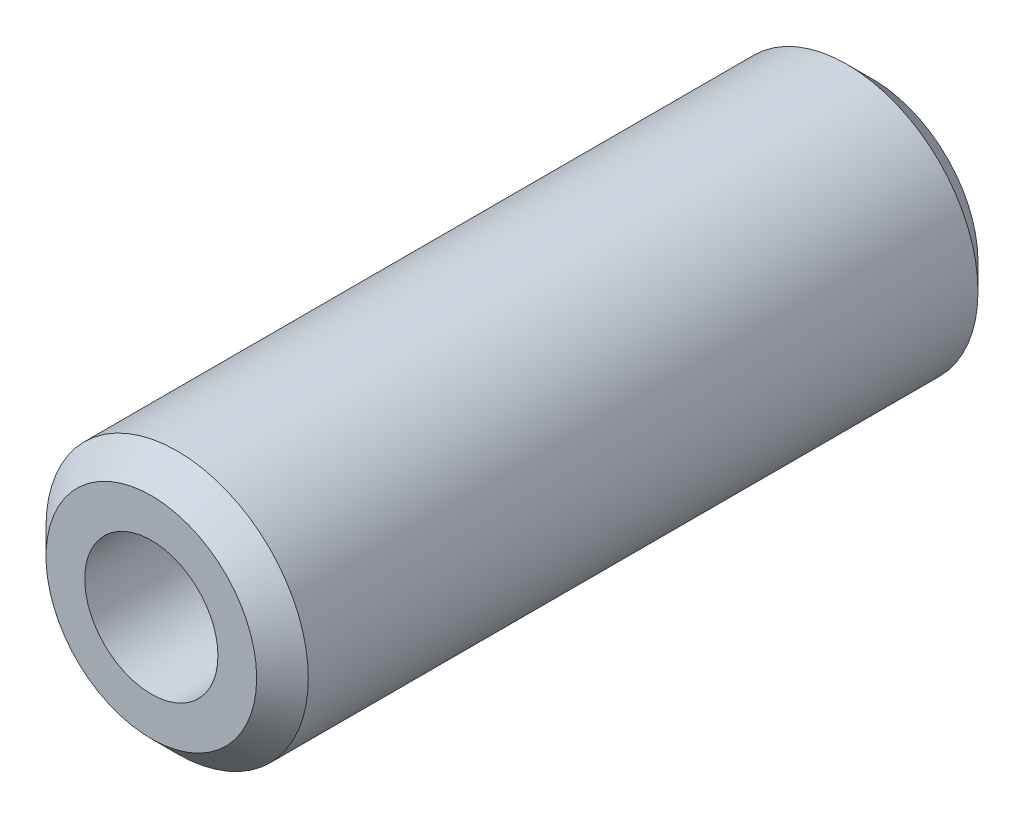
ISO-10303-21;
HEADER;
FILE_DESCRIPTION(('STEP AP214'),'2;1');
FILE_NAME('part.step','',(''),(''),'','','');
FILE_SCHEMA(('AUTOMOTIVE_DESIGN { 1 0 10303 214 1 1 1 1 }'));
ENDSEC;
DATA;
#1=APPLICATION_CONTEXT('core data for automotive mechanical design processes');
#2=APPLICATION_PROTOCOL_DEFINITION('international standard','automotive_design',2000,#1);
#3=PRODUCT_CONTEXT('',#1,'mechanical');
#4=PRODUCT('Part','Part','',(#3));
#5=PRODUCT_RELATED_PRODUCT_CATEGORY('part','',(#4));
#6=PRODUCT_DEFINITION_FORMATION('','',#4);
#7=PRODUCT_DEFINITION_CONTEXT('part definition',#1,'design');
#8=PRODUCT_DEFINITION('design','',#6,#7);
#9=PRODUCT_DEFINITION_SHAPE('','',#8);
#10=(LENGTH_UNIT() NAMED_UNIT(*) SI_UNIT(.MILLI.,.METRE.));
#11=(NAMED_UNIT(*) PLANE_ANGLE_UNIT() SI_UNIT($,.RADIAN.));
#12=(NAMED_UNIT(*) SI_UNIT($,.STERADIAN.) SOLID_ANGLE_UNIT());
#13=UNCERTAINTY_MEASURE_WITH_UNIT(LENGTH_MEASURE(1.E-05),#10,'distance_accuracy_value','');
#14=(GEOMETRIC_REPRESENTATION_CONTEXT(3) GLOBAL_UNCERTAINTY_ASSIGNED_CONTEXT((#13)) GLOBAL_UNIT_ASSIGNED_CONTEXT((#10,
#11,#12)) REPRESENTATION_CONTEXT('',''));
#15=CARTESIAN_POINT('',(0.,0.,0.));
#16=DIRECTION('',(0.,0.,1.));
#17=DIRECTION('',(1.,0.,0.));
#18=AXIS2_PLACEMENT_3D('',#15,#16,#17);
#19=CARTESIAN_POINT('',(0.,0.,34.925));
#20=DIRECTION('',(0.,0.,-1.));
#21=DIRECTION('',(-1.,0.,0.));
#22=AXIS2_PLACEMENT_3D('',#19,#20,#21);
#23=CYLINDRICAL_SURFACE('',#22,12.7);
#24=CARTESIAN_POINT('',(0.,0.,-32.425));
#25=DIRECTION('',(0.,0.,1.));
#26=DIRECTION('',(1.,0.,0.));
#27=AXIS2_PLACEMENT_3D('',#24,#25,#26);
#28=CIRCLE('',#27,12.7);
#29=CARTESIAN_POINT('',(12.7,0.,-32.425));
#30=VERTEX_POINT('',#29);
#31=EDGE_CURVE('E45',#30,#30,#28,.T.);
#32=ORIENTED_EDGE('',*,*,#31,.T.);
#33=EDGE_LOOP('',(#32));
#34=FACE_BOUND('',#33,.T.);
#35=CARTESIAN_POINT('',(0.,0.,32.425));
#36=DIRECTION('',(0.,0.,1.));
#37=DIRECTION('',(1.,0.,0.));
#38=AXIS2_PLACEMENT_3D('',#35,#36,#37);
#39=CIRCLE('',#38,12.7);
#40=CARTESIAN_POINT('',(12.7,0.,32.425));
#41=VERTEX_POINT('',#40);
#42=EDGE_CURVE('E49',#41,#41,#39,.F.);
#43=ORIENTED_EDGE('',*,*,#42,.T.);
#44=EDGE_LOOP('',(#43));
#45=FACE_BOUND('',#44,.T.);
#46=ADVANCED_FACE('F33',(#34,#45),#23,.T.);
#47=CARTESIAN_POINT('',(0.,0.,34.925));
#48=DIRECTION('',(0.,0.,1.));
#49=DIRECTION('',(1.,0.,0.));
#50=AXIS2_PLACEMENT_3D('',#47,#48,#49);
#51=PLANE('',#50);
#52=CARTESIAN_POINT('',(0.,0.,34.925));
#53=DIRECTION('',(0.,0.,1.));
#54=DIRECTION('',(1.,0.,0.));
#55=AXIS2_PLACEMENT_3D('',#52,#53,#54);
#56=CIRCLE('',#55,10.2);
#57=CARTESIAN_POINT('',(10.2,0.,34.925));
#58=VERTEX_POINT('',#57);
#59=EDGE_CURVE('E10',#58,#58,#56,.T.);
#60=ORIENTED_EDGE('',*,*,#59,.T.);
#61=EDGE_LOOP('',(#60));
#62=FACE_BOUND('',#61,.T.);
#63=CARTESIAN_POINT('',(0.,0.,34.925));
#64=DIRECTION('',(0.,0.,1.));
#65=DIRECTION('',(1.,0.,0.));
#66=AXIS2_PLACEMENT_3D('',#63,#64,#65);
#67=CIRCLE('',#66,6.45);
#68=CARTESIAN_POINT('',(6.45,0.,34.925));
#69=VERTEX_POINT('',#68);
#70=EDGE_CURVE('E55',#69,#69,#67,.T.);
#71=ORIENTED_EDGE('',*,*,#70,.F.);
#72=EDGE_LOOP('',(#71));
#73=FACE_BOUND('',#72,.T.);
#74=ADVANCED_FACE('F70',(#62,#73),#51,.T.);
#75=CARTESIAN_POINT('',(0.,0.,-34.925));
#76=DIRECTION('',(0.,0.,1.));
#77=DIRECTION('',(1.,0.,0.));
#78=AXIS2_PLACEMENT_3D('',#75,#76,#77);
#79=PLANE('',#78);
#80=CARTESIAN_POINT('',(0.,0.,-34.925));
#81=DIRECTION('',(0.,0.,1.));
#82=DIRECTION('',(1.,0.,0.));
#83=AXIS2_PLACEMENT_3D('',#80,#81,#82);
#84=CIRCLE('',#83,10.2);
#85=CARTESIAN_POINT('',(10.2,0.,-34.925));
#86=VERTEX_POINT('',#85);
#87=EDGE_CURVE('E41',#86,#86,#84,.F.);
#88=ORIENTED_EDGE('',*,*,#87,.T.);
#89=EDGE_LOOP('',(#88));
#90=FACE_BOUND('',#89,.T.);
#91=CARTESIAN_POINT('',(0.,0.,-34.925));
#92=DIRECTION('',(0.,0.,1.));
#93=DIRECTION('',(1.,0.,0.));
#94=AXIS2_PLACEMENT_3D('',#91,#92,#93);
#95=CIRCLE('',#94,6.45);
#96=CARTESIAN_POINT('',(6.45,0.,-34.925));
#97=VERTEX_POINT('',#96);
#98=EDGE_CURVE('E54',#97,#97,#95,.T.);
#99=ORIENTED_EDGE('',*,*,#98,.T.);
#100=EDGE_LOOP('',(#99));
#101=FACE_BOUND('',#100,.T.);
#102=ADVANCED_FACE('F61',(#90,#101),#79,.F.);
#103=CARTESIAN_POINT('',(0.,0.,-34.925));
#104=DIRECTION('',(0.,0.,1.));
#105=DIRECTION('',(1.,0.,0.));
#106=AXIS2_PLACEMENT_3D('',#103,#104,#105);
#107=CYLINDRICAL_SURFACE('',#106,6.45);
#108=ORIENTED_EDGE('',*,*,#98,.F.);
#109=EDGE_LOOP('',(#108));
#110=FACE_BOUND('',#109,.T.);
#111=ORIENTED_EDGE('',*,*,#70,.T.);
#112=EDGE_LOOP('',(#111));
#113=FACE_BOUND('',#112,.T.);
#114=ADVANCED_FACE('F63',(#110,#113),#107,.F.);
#115=CARTESIAN_POINT('',(0.,0.,-32.425));
#116=DIRECTION('',(0.,0.,1.));
#117=DIRECTION('',(1.,0.,0.));
#118=AXIS2_PLACEMENT_3D('',#115,#116,#117);
#119=CONICAL_SURFACE('',#118,12.7,0.785398163397448);
#120=ORIENTED_EDGE('',*,*,#87,.F.);
#121=EDGE_LOOP('',(#120));
#122=FACE_BOUND('',#121,.T.);
#123=ORIENTED_EDGE('',*,*,#31,.F.);
#124=EDGE_LOOP('',(#123));
#125=FACE_BOUND('',#124,.T.);
#126=ADVANCED_FACE('F66',(#122,#125),#119,.T.);
#127=CARTESIAN_POINT('',(0.,0.,34.925));
#128=DIRECTION('',(0.,0.,-1.));
#129=DIRECTION('',(-1.,0.,0.));
#130=AXIS2_PLACEMENT_3D('',#127,#128,#129);
#131=CONICAL_SURFACE('',#130,10.2,0.785398163397448);
#132=ORIENTED_EDGE('',*,*,#42,.F.);
#133=EDGE_LOOP('',(#132));
#134=FACE_BOUND('',#133,.T.);
#135=ORIENTED_EDGE('',*,*,#59,.F.);
#136=EDGE_LOOP('',(#135));
#137=FACE_BOUND('',#136,.T.);
#138=ADVANCED_FACE('F36',(#134,#137),#131,.T.);
#139=CLOSED_SHELL('',(#46,#74,#102,#114,#126,#138));
#140=MANIFOLD_SOLID_BREP('B2',#139);
#141=ADVANCED_BREP_SHAPE_REPRESENTATION('',(#18,#140),#14);
#142=SHAPE_DEFINITION_REPRESENTATION(#9,#141);
ENDSEC;
END-ISO-10303-21;
